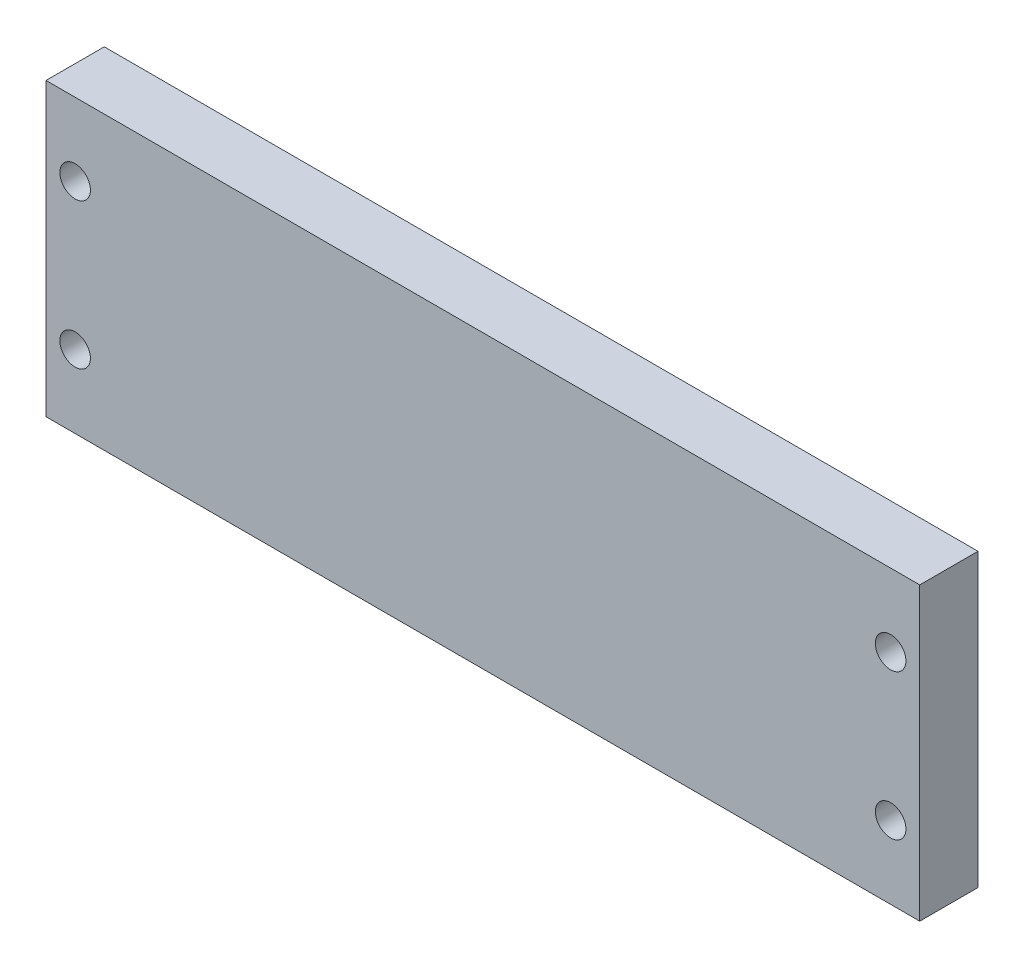
ISO-10303-21;
HEADER;
FILE_DESCRIPTION(('STEP AP214'),'2;1');
FILE_NAME('part.step','',(''),(''),'','','');
FILE_SCHEMA(('AUTOMOTIVE_DESIGN { 1 0 10303 214 1 1 1 1 }'));
ENDSEC;
DATA;
#1=APPLICATION_CONTEXT('core data for automotive mechanical design processes');
#2=APPLICATION_PROTOCOL_DEFINITION('international standard','automotive_design',2000,#1);
#3=PRODUCT_CONTEXT('',#1,'mechanical');
#4=PRODUCT('Part','Part','',(#3));
#5=PRODUCT_RELATED_PRODUCT_CATEGORY('part','',(#4));
#6=PRODUCT_DEFINITION_FORMATION('','',#4);
#7=PRODUCT_DEFINITION_CONTEXT('part definition',#1,'design');
#8=PRODUCT_DEFINITION('design','',#6,#7);
#9=PRODUCT_DEFINITION_SHAPE('','',#8);
#10=(LENGTH_UNIT() NAMED_UNIT(*) SI_UNIT(.MILLI.,.METRE.));
#11=(NAMED_UNIT(*) PLANE_ANGLE_UNIT() SI_UNIT($,.RADIAN.));
#12=(NAMED_UNIT(*) SI_UNIT($,.STERADIAN.) SOLID_ANGLE_UNIT());
#13=UNCERTAINTY_MEASURE_WITH_UNIT(LENGTH_MEASURE(1.E-05),#10,'distance_accuracy_value','');
#14=(GEOMETRIC_REPRESENTATION_CONTEXT(3) GLOBAL_UNCERTAINTY_ASSIGNED_CONTEXT((#13)) GLOBAL_UNIT_ASSIGNED_CONTEXT((#10,
#11,#12)) REPRESENTATION_CONTEXT('',''));
#15=CARTESIAN_POINT('',(0.,0.,0.));
#16=DIRECTION('',(0.,0.,1.));
#17=DIRECTION('',(1.,0.,0.));
#18=AXIS2_PLACEMENT_3D('',#15,#16,#17);
#19=CARTESIAN_POINT('',(-56.,-10.,-42.));
#20=DIRECTION('',(0.,0.,1.));
#21=DIRECTION('',(1.,0.,0.));
#22=AXIS2_PLACEMENT_3D('',#19,#20,#21);
#23=CYLINDRICAL_SURFACE('',#22,2.1);
#24=CARTESIAN_POINT('',(-56.,-10.,8.));
#25=DIRECTION('',(0.,0.,1.));
#26=DIRECTION('',(1.,0.,0.));
#27=AXIS2_PLACEMENT_3D('',#24,#25,#26);
#28=CIRCLE('',#27,2.1);
#29=CARTESIAN_POINT('',(-53.9,-10.,8.));
#30=VERTEX_POINT('',#29);
#31=EDGE_CURVE('E148',#30,#30,#28,.T.);
#32=ORIENTED_EDGE('',*,*,#31,.T.);
#33=EDGE_LOOP('',(#32));
#34=FACE_BOUND('',#33,.T.);
#35=CARTESIAN_POINT('',(-56.,-10.,5.));
#36=DIRECTION('',(0.,0.,-1.));
#37=DIRECTION('',(-1.,0.,0.));
#38=AXIS2_PLACEMENT_3D('',#35,#36,#37);
#39=CIRCLE('',#38,2.1);
#40=CARTESIAN_POINT('',(-58.1,-10.,5.));
#41=VERTEX_POINT('',#40);
#42=EDGE_CURVE('E37',#41,#41,#39,.F.);
#43=ORIENTED_EDGE('',*,*,#42,.F.);
#44=EDGE_LOOP('',(#43));
#45=FACE_BOUND('',#44,.T.);
#46=ADVANCED_FACE('F33',(#34,#45),#23,.F.);
#47=CARTESIAN_POINT('',(-56.,10.,-42.));
#48=DIRECTION('',(0.,0.,1.));
#49=DIRECTION('',(1.,0.,0.));
#50=AXIS2_PLACEMENT_3D('',#47,#48,#49);
#51=CYLINDRICAL_SURFACE('',#50,2.1);
#52=CARTESIAN_POINT('',(-56.,10.,8.));
#53=DIRECTION('',(0.,0.,1.));
#54=DIRECTION('',(1.,0.,0.));
#55=AXIS2_PLACEMENT_3D('',#52,#53,#54);
#56=CIRCLE('',#55,2.1);
#57=CARTESIAN_POINT('',(-53.9,10.,8.));
#58=VERTEX_POINT('',#57);
#59=EDGE_CURVE('E103',#58,#58,#56,.T.);
#60=ORIENTED_EDGE('',*,*,#59,.T.);
#61=EDGE_LOOP('',(#60));
#62=FACE_BOUND('',#61,.T.);
#63=CARTESIAN_POINT('',(-56.,10.,5.));
#64=DIRECTION('',(0.,0.,-1.));
#65=DIRECTION('',(-1.,0.,0.));
#66=AXIS2_PLACEMENT_3D('',#63,#64,#65);
#67=CIRCLE('',#66,2.1);
#68=CARTESIAN_POINT('',(-58.1,10.,5.));
#69=VERTEX_POINT('',#68);
#70=EDGE_CURVE('E118',#69,#69,#67,.F.);
#71=ORIENTED_EDGE('',*,*,#70,.F.);
#72=EDGE_LOOP('',(#71));
#73=FACE_BOUND('',#72,.T.);
#74=ADVANCED_FACE('F154',(#62,#73),#51,.F.);
#75=CARTESIAN_POINT('',(56.,-10.,-42.));
#76=DIRECTION('',(0.,0.,1.));
#77=DIRECTION('',(1.,0.,0.));
#78=AXIS2_PLACEMENT_3D('',#75,#76,#77);
#79=CYLINDRICAL_SURFACE('',#78,2.1);
#80=CARTESIAN_POINT('',(56.,-10.,8.));
#81=DIRECTION('',(0.,0.,1.));
#82=DIRECTION('',(1.,0.,0.));
#83=AXIS2_PLACEMENT_3D('',#80,#81,#82);
#84=CIRCLE('',#83,2.1);
#85=CARTESIAN_POINT('',(58.1,-10.,8.));
#86=VERTEX_POINT('',#85);
#87=EDGE_CURVE('E112',#86,#86,#84,.T.);
#88=ORIENTED_EDGE('',*,*,#87,.T.);
#89=EDGE_LOOP('',(#88));
#90=FACE_BOUND('',#89,.T.);
#91=CARTESIAN_POINT('',(56.,-10.,5.));
#92=DIRECTION('',(0.,0.,-1.));
#93=DIRECTION('',(-1.,0.,0.));
#94=AXIS2_PLACEMENT_3D('',#91,#92,#93);
#95=CIRCLE('',#94,2.1);
#96=CARTESIAN_POINT('',(53.9,-10.,5.));
#97=VERTEX_POINT('',#96);
#98=EDGE_CURVE('E114',#97,#97,#95,.F.);
#99=ORIENTED_EDGE('',*,*,#98,.F.);
#100=EDGE_LOOP('',(#99));
#101=FACE_BOUND('',#100,.T.);
#102=ADVANCED_FACE('F179',(#90,#101),#79,.F.);
#103=CARTESIAN_POINT('',(56.,10.,-42.));
#104=DIRECTION('',(0.,0.,1.));
#105=DIRECTION('',(1.,0.,0.));
#106=AXIS2_PLACEMENT_3D('',#103,#104,#105);
#107=CYLINDRICAL_SURFACE('',#106,2.1);
#108=CARTESIAN_POINT('',(56.,10.,8.));
#109=DIRECTION('',(0.,0.,1.));
#110=DIRECTION('',(1.,0.,0.));
#111=AXIS2_PLACEMENT_3D('',#108,#109,#110);
#112=CIRCLE('',#111,2.1);
#113=CARTESIAN_POINT('',(58.1,10.,8.));
#114=VERTEX_POINT('',#113);
#115=EDGE_CURVE('E145',#114,#114,#112,.T.);
#116=ORIENTED_EDGE('',*,*,#115,.T.);
#117=EDGE_LOOP('',(#116));
#118=FACE_BOUND('',#117,.T.);
#119=CARTESIAN_POINT('',(56.,10.,5.));
#120=DIRECTION('',(0.,0.,-1.));
#121=DIRECTION('',(-1.,0.,0.));
#122=AXIS2_PLACEMENT_3D('',#119,#120,#121);
#123=CIRCLE('',#122,2.1);
#124=CARTESIAN_POINT('',(53.9,10.,5.));
#125=VERTEX_POINT('',#124);
#126=EDGE_CURVE('E109',#125,#125,#123,.F.);
#127=ORIENTED_EDGE('',*,*,#126,.F.);
#128=EDGE_LOOP('',(#127));
#129=FACE_BOUND('',#128,.T.);
#130=ADVANCED_FACE('F182',(#118,#129),#107,.F.);
#131=CARTESIAN_POINT('',(60.,20.,8.));
#132=DIRECTION('',(-1.,0.,0.));
#133=DIRECTION('',(0.,-1.,0.));
#134=AXIS2_PLACEMENT_3D('',#131,#132,#133);
#135=PLANE('',#134);
#136=DIRECTION('',(0.,1.,0.));
#137=VECTOR('',#136,1.);
#138=CARTESIAN_POINT('',(60.,20.,0.));
#139=LINE('',#138,#137);
#140=CARTESIAN_POINT('',(60.,-20.,0.));
#141=VERTEX_POINT('',#140);
#142=CARTESIAN_POINT('',(60.,20.,0.));
#143=VERTEX_POINT('',#142);
#144=EDGE_CURVE('E100',#141,#143,#139,.T.);
#145=ORIENTED_EDGE('',*,*,#144,.T.);
#146=DIRECTION('',(0.,0.,-1.));
#147=VECTOR('',#146,1.);
#148=CARTESIAN_POINT('',(60.,20.,8.));
#149=LINE('',#148,#147);
#150=CARTESIAN_POINT('',(60.,20.,8.));
#151=VERTEX_POINT('',#150);
#152=EDGE_CURVE('E11',#151,#143,#149,.T.);
#153=ORIENTED_EDGE('',*,*,#152,.F.);
#154=DIRECTION('',(0.,1.,0.));
#155=VECTOR('',#154,1.);
#156=CARTESIAN_POINT('',(60.,20.,8.));
#157=LINE('',#156,#155);
#158=CARTESIAN_POINT('',(60.,-20.,8.));
#159=VERTEX_POINT('',#158);
#160=EDGE_CURVE('E87',#159,#151,#157,.T.);
#161=ORIENTED_EDGE('',*,*,#160,.F.);
#162=DIRECTION('',(0.,0.,-1.));
#163=VECTOR('',#162,1.);
#164=CARTESIAN_POINT('',(60.,-20.,8.));
#165=LINE('',#164,#163);
#166=EDGE_CURVE('E96',#159,#141,#165,.T.);
#167=ORIENTED_EDGE('',*,*,#166,.T.);
#168=EDGE_LOOP('',(#145,#153,#161,#167));
#169=FACE_BOUND('',#168,.T.);
#170=ADVANCED_FACE('F35',(#169),#135,.F.);
#171=CARTESIAN_POINT('',(-60.,20.,8.));
#172=DIRECTION('',(0.,-1.,0.));
#173=DIRECTION('',(0.,0.,-1.));
#174=AXIS2_PLACEMENT_3D('',#171,#172,#173);
#175=PLANE('',#174);
#176=DIRECTION('',(-1.,0.,0.));
#177=VECTOR('',#176,1.);
#178=CARTESIAN_POINT('',(-60.,20.,0.));
#179=LINE('',#178,#177);
#180=CARTESIAN_POINT('',(-60.,20.,0.));
#181=VERTEX_POINT('',#180);
#182=EDGE_CURVE('E91',#143,#181,#179,.T.);
#183=ORIENTED_EDGE('',*,*,#182,.T.);
#184=DIRECTION('',(0.,0.,-1.));
#185=VECTOR('',#184,1.);
#186=CARTESIAN_POINT('',(-60.,20.,8.));
#187=LINE('',#186,#185);
#188=CARTESIAN_POINT('',(-60.,20.,8.));
#189=VERTEX_POINT('',#188);
#190=EDGE_CURVE('E43',#189,#181,#187,.T.);
#191=ORIENTED_EDGE('',*,*,#190,.F.);
#192=DIRECTION('',(-1.,0.,0.));
#193=VECTOR('',#192,1.);
#194=CARTESIAN_POINT('',(-60.,20.,8.));
#195=LINE('',#194,#193);
#196=EDGE_CURVE('E82',#151,#189,#195,.T.);
#197=ORIENTED_EDGE('',*,*,#196,.F.);
#198=ORIENTED_EDGE('',*,*,#152,.T.);
#199=EDGE_LOOP('',(#183,#191,#197,#198));
#200=FACE_BOUND('',#199,.T.);
#201=ADVANCED_FACE('F90',(#200),#175,.F.);
#202=CARTESIAN_POINT('',(-60.,20.,8.));
#203=DIRECTION('',(1.,0.,0.));
#204=DIRECTION('',(0.,0.,-1.));
#205=AXIS2_PLACEMENT_3D('',#202,#203,#204);
#206=PLANE('',#205);
#207=DIRECTION('',(0.,-1.,0.));
#208=VECTOR('',#207,1.);
#209=CARTESIAN_POINT('',(-60.,20.,0.));
#210=LINE('',#209,#208);
#211=CARTESIAN_POINT('',(-60.,-20.,0.));
#212=VERTEX_POINT('',#211);
#213=EDGE_CURVE('E69',#181,#212,#210,.T.);
#214=ORIENTED_EDGE('',*,*,#213,.T.);
#215=DIRECTION('',(0.,0.,-1.));
#216=VECTOR('',#215,1.);
#217=CARTESIAN_POINT('',(-60.,-20.,8.));
#218=LINE('',#217,#216);
#219=CARTESIAN_POINT('',(-60.,-20.,8.));
#220=VERTEX_POINT('',#219);
#221=EDGE_CURVE('E92',#220,#212,#218,.T.);
#222=ORIENTED_EDGE('',*,*,#221,.F.);
#223=DIRECTION('',(0.,-1.,0.));
#224=VECTOR('',#223,1.);
#225=CARTESIAN_POINT('',(-60.,20.,8.));
#226=LINE('',#225,#224);
#227=EDGE_CURVE('E85',#189,#220,#226,.T.);
#228=ORIENTED_EDGE('',*,*,#227,.F.);
#229=ORIENTED_EDGE('',*,*,#190,.T.);
#230=EDGE_LOOP('',(#214,#222,#228,#229));
#231=FACE_BOUND('',#230,.T.);
#232=ADVANCED_FACE('F94',(#231),#206,.F.);
#233=CARTESIAN_POINT('',(-60.,-20.,8.));
#234=DIRECTION('',(0.,1.,0.));
#235=DIRECTION('',(0.,0.,1.));
#236=AXIS2_PLACEMENT_3D('',#233,#234,#235);
#237=PLANE('',#236);
#238=DIRECTION('',(1.,0.,0.));
#239=VECTOR('',#238,1.);
#240=CARTESIAN_POINT('',(-60.,-20.,0.));
#241=LINE('',#240,#239);
#242=EDGE_CURVE('E75',#212,#141,#241,.T.);
#243=ORIENTED_EDGE('',*,*,#242,.T.);
#244=ORIENTED_EDGE('',*,*,#166,.F.);
#245=DIRECTION('',(1.,0.,0.));
#246=VECTOR('',#245,1.);
#247=CARTESIAN_POINT('',(-60.,-20.,8.));
#248=LINE('',#247,#246);
#249=EDGE_CURVE('E52',#220,#159,#248,.T.);
#250=ORIENTED_EDGE('',*,*,#249,.F.);
#251=ORIENTED_EDGE('',*,*,#221,.T.);
#252=EDGE_LOOP('',(#243,#244,#250,#251));
#253=FACE_BOUND('',#252,.T.);
#254=ADVANCED_FACE('F159',(#253),#237,.F.);
#255=CARTESIAN_POINT('',(0.,0.,8.));
#256=DIRECTION('',(0.,0.,1.));
#257=DIRECTION('',(1.,0.,0.));
#258=AXIS2_PLACEMENT_3D('',#255,#256,#257);
#259=PLANE('',#258);
#260=ORIENTED_EDGE('',*,*,#87,.F.);
#261=EDGE_LOOP('',(#260));
#262=FACE_BOUND('',#261,.T.);
#263=ORIENTED_EDGE('',*,*,#115,.F.);
#264=EDGE_LOOP('',(#263));
#265=FACE_BOUND('',#264,.T.);
#266=ORIENTED_EDGE('',*,*,#31,.F.);
#267=EDGE_LOOP('',(#266));
#268=FACE_BOUND('',#267,.T.);
#269=ORIENTED_EDGE('',*,*,#59,.F.);
#270=EDGE_LOOP('',(#269));
#271=FACE_BOUND('',#270,.T.);
#272=ORIENTED_EDGE('',*,*,#160,.T.);
#273=ORIENTED_EDGE('',*,*,#196,.T.);
#274=ORIENTED_EDGE('',*,*,#227,.T.);
#275=ORIENTED_EDGE('',*,*,#249,.T.);
#276=EDGE_LOOP('',(#272,#273,#274,#275));
#277=FACE_BOUND('',#276,.T.);
#278=ADVANCED_FACE('F83',(#262,#265,#268,#271,#277),#259,.T.);
#279=CARTESIAN_POINT('',(0.,0.,0.));
#280=DIRECTION('',(0.,0.,1.));
#281=DIRECTION('',(1.,0.,0.));
#282=AXIS2_PLACEMENT_3D('',#279,#280,#281);
#283=PLANE('',#282);
#284=CARTESIAN_POINT('',(-56.,-10.,0.));
#285=DIRECTION('',(0.,0.,-1.));
#286=DIRECTION('',(-1.,0.,0.));
#287=AXIS2_PLACEMENT_3D('',#284,#285,#286);
#288=CIRCLE('',#287,3.55);
#289=CARTESIAN_POINT('',(-59.55,-10.,0.));
#290=VERTEX_POINT('',#289);
#291=EDGE_CURVE('E134',#290,#290,#288,.T.);
#292=ORIENTED_EDGE('',*,*,#291,.F.);
#293=EDGE_LOOP('',(#292));
#294=FACE_BOUND('',#293,.T.);
#295=CARTESIAN_POINT('',(-56.,10.,0.));
#296=DIRECTION('',(0.,0.,-1.));
#297=DIRECTION('',(-1.,0.,0.));
#298=AXIS2_PLACEMENT_3D('',#295,#296,#297);
#299=CIRCLE('',#298,3.55);
#300=CARTESIAN_POINT('',(-59.55,10.,0.));
#301=VERTEX_POINT('',#300);
#302=EDGE_CURVE('E127',#301,#301,#299,.T.);
#303=ORIENTED_EDGE('',*,*,#302,.F.);
#304=EDGE_LOOP('',(#303));
#305=FACE_BOUND('',#304,.T.);
#306=CARTESIAN_POINT('',(56.,-10.,0.));
#307=DIRECTION('',(0.,0.,-1.));
#308=DIRECTION('',(-1.,0.,0.));
#309=AXIS2_PLACEMENT_3D('',#306,#307,#308);
#310=CIRCLE('',#309,3.55);
#311=CARTESIAN_POINT('',(52.45,-10.,0.));
#312=VERTEX_POINT('',#311);
#313=EDGE_CURVE('E120',#312,#312,#310,.T.);
#314=ORIENTED_EDGE('',*,*,#313,.F.);
#315=EDGE_LOOP('',(#314));
#316=FACE_BOUND('',#315,.T.);
#317=CARTESIAN_POINT('',(56.,10.,0.));
#318=DIRECTION('',(0.,0.,-1.));
#319=DIRECTION('',(-1.,0.,0.));
#320=AXIS2_PLACEMENT_3D('',#317,#318,#319);
#321=CIRCLE('',#320,3.55);
#322=CARTESIAN_POINT('',(52.45,10.,0.));
#323=VERTEX_POINT('',#322);
#324=EDGE_CURVE('E116',#323,#323,#321,.T.);
#325=ORIENTED_EDGE('',*,*,#324,.F.);
#326=EDGE_LOOP('',(#325));
#327=FACE_BOUND('',#326,.T.);
#328=ORIENTED_EDGE('',*,*,#144,.F.);
#329=ORIENTED_EDGE('',*,*,#242,.F.);
#330=ORIENTED_EDGE('',*,*,#213,.F.);
#331=ORIENTED_EDGE('',*,*,#182,.F.);
#332=EDGE_LOOP('',(#328,#329,#330,#331));
#333=FACE_BOUND('',#332,.T.);
#334=ADVANCED_FACE('F158',(#294,#305,#316,#327,#333),#283,.F.);
#335=CARTESIAN_POINT('',(56.,10.,5.));
#336=DIRECTION('',(0.,0.,-1.));
#337=DIRECTION('',(-1.,0.,0.));
#338=AXIS2_PLACEMENT_3D('',#335,#336,#337);
#339=PLANE('',#338);
#340=CARTESIAN_POINT('',(56.,10.,5.));
#341=DIRECTION('',(0.,0.,-1.));
#342=DIRECTION('',(-1.,0.,0.));
#343=AXIS2_PLACEMENT_3D('',#340,#341,#342);
#344=CIRCLE('',#343,3.55);
#345=CARTESIAN_POINT('',(52.45,10.,5.));
#346=VERTEX_POINT('',#345);
#347=EDGE_CURVE('E113',#346,#346,#344,.T.);
#348=ORIENTED_EDGE('',*,*,#347,.T.);
#349=EDGE_LOOP('',(#348));
#350=FACE_BOUND('',#349,.T.);
#351=ORIENTED_EDGE('',*,*,#126,.T.);
#352=EDGE_LOOP('',(#351));
#353=FACE_BOUND('',#352,.T.);
#354=ADVANCED_FACE('F166',(#350,#353),#339,.T.);
#355=CARTESIAN_POINT('',(56.,10.,5.));
#356=DIRECTION('',(0.,0.,-1.));
#357=DIRECTION('',(-1.,0.,0.));
#358=AXIS2_PLACEMENT_3D('',#355,#356,#357);
#359=CYLINDRICAL_SURFACE('',#358,3.55);
#360=ORIENTED_EDGE('',*,*,#347,.F.);
#361=EDGE_LOOP('',(#360));
#362=FACE_BOUND('',#361,.T.);
#363=ORIENTED_EDGE('',*,*,#324,.T.);
#364=EDGE_LOOP('',(#363));
#365=FACE_BOUND('',#364,.T.);
#366=ADVANCED_FACE('F189',(#362,#365),#359,.F.);
#367=CARTESIAN_POINT('',(56.,-10.,5.));
#368=DIRECTION('',(0.,0.,-1.));
#369=DIRECTION('',(-1.,0.,0.));
#370=AXIS2_PLACEMENT_3D('',#367,#368,#369);
#371=PLANE('',#370);
#372=CARTESIAN_POINT('',(56.,-10.,5.));
#373=DIRECTION('',(0.,0.,-1.));
#374=DIRECTION('',(-1.,0.,0.));
#375=AXIS2_PLACEMENT_3D('',#372,#373,#374);
#376=CIRCLE('',#375,3.55);
#377=CARTESIAN_POINT('',(52.45,-10.,5.));
#378=VERTEX_POINT('',#377);
#379=EDGE_CURVE('E117',#378,#378,#376,.T.);
#380=ORIENTED_EDGE('',*,*,#379,.T.);
#381=EDGE_LOOP('',(#380));
#382=FACE_BOUND('',#381,.T.);
#383=ORIENTED_EDGE('',*,*,#98,.T.);
#384=EDGE_LOOP('',(#383));
#385=FACE_BOUND('',#384,.T.);
#386=ADVANCED_FACE('F192',(#382,#385),#371,.T.);
#387=CARTESIAN_POINT('',(56.,-10.,5.));
#388=DIRECTION('',(0.,0.,-1.));
#389=DIRECTION('',(-1.,0.,0.));
#390=AXIS2_PLACEMENT_3D('',#387,#388,#389);
#391=CYLINDRICAL_SURFACE('',#390,3.55);
#392=ORIENTED_EDGE('',*,*,#379,.F.);
#393=EDGE_LOOP('',(#392));
#394=FACE_BOUND('',#393,.T.);
#395=ORIENTED_EDGE('',*,*,#313,.T.);
#396=EDGE_LOOP('',(#395));
#397=FACE_BOUND('',#396,.T.);
#398=ADVANCED_FACE('F197',(#394,#397),#391,.F.);
#399=CARTESIAN_POINT('',(-56.,10.,5.));
#400=DIRECTION('',(0.,0.,-1.));
#401=DIRECTION('',(-1.,0.,0.));
#402=AXIS2_PLACEMENT_3D('',#399,#400,#401);
#403=PLANE('',#402);
#404=CARTESIAN_POINT('',(-56.,10.,5.));
#405=DIRECTION('',(0.,0.,-1.));
#406=DIRECTION('',(-1.,0.,0.));
#407=AXIS2_PLACEMENT_3D('',#404,#405,#406);
#408=CIRCLE('',#407,3.55);
#409=CARTESIAN_POINT('',(-59.55,10.,5.));
#410=VERTEX_POINT('',#409);
#411=EDGE_CURVE('E121',#410,#410,#408,.T.);
#412=ORIENTED_EDGE('',*,*,#411,.T.);
#413=EDGE_LOOP('',(#412));
#414=FACE_BOUND('',#413,.T.);
#415=ORIENTED_EDGE('',*,*,#70,.T.);
#416=EDGE_LOOP('',(#415));
#417=FACE_BOUND('',#416,.T.);
#418=ADVANCED_FACE('F200',(#414,#417),#403,.T.);
#419=CARTESIAN_POINT('',(-56.,10.,5.));
#420=DIRECTION('',(0.,0.,-1.));
#421=DIRECTION('',(-1.,0.,0.));
#422=AXIS2_PLACEMENT_3D('',#419,#420,#421);
#423=CYLINDRICAL_SURFACE('',#422,3.55);
#424=ORIENTED_EDGE('',*,*,#411,.F.);
#425=EDGE_LOOP('',(#424));
#426=FACE_BOUND('',#425,.T.);
#427=ORIENTED_EDGE('',*,*,#302,.T.);
#428=EDGE_LOOP('',(#427));
#429=FACE_BOUND('',#428,.T.);
#430=ADVANCED_FACE('F205',(#426,#429),#423,.F.);
#431=CARTESIAN_POINT('',(-56.,-10.,5.));
#432=DIRECTION('',(0.,0.,-1.));
#433=DIRECTION('',(-1.,0.,0.));
#434=AXIS2_PLACEMENT_3D('',#431,#432,#433);
#435=PLANE('',#434);
#436=CARTESIAN_POINT('',(-56.,-10.,5.));
#437=DIRECTION('',(0.,0.,-1.));
#438=DIRECTION('',(-1.,0.,0.));
#439=AXIS2_PLACEMENT_3D('',#436,#437,#438);
#440=CIRCLE('',#439,3.55);
#441=CARTESIAN_POINT('',(-59.55,-10.,5.));
#442=VERTEX_POINT('',#441);
#443=EDGE_CURVE('E223',#442,#442,#440,.T.);
#444=ORIENTED_EDGE('',*,*,#443,.T.);
#445=EDGE_LOOP('',(#444));
#446=FACE_BOUND('',#445,.T.);
#447=ORIENTED_EDGE('',*,*,#42,.T.);
#448=EDGE_LOOP('',(#447));
#449=FACE_BOUND('',#448,.T.);
#450=ADVANCED_FACE('F208',(#446,#449),#435,.T.);
#451=CARTESIAN_POINT('',(-56.,-10.,5.));
#452=DIRECTION('',(0.,0.,-1.));
#453=DIRECTION('',(-1.,0.,0.));
#454=AXIS2_PLACEMENT_3D('',#451,#452,#453);
#455=CYLINDRICAL_SURFACE('',#454,3.55);
#456=ORIENTED_EDGE('',*,*,#443,.F.);
#457=EDGE_LOOP('',(#456));
#458=FACE_BOUND('',#457,.T.);
#459=ORIENTED_EDGE('',*,*,#291,.T.);
#460=EDGE_LOOP('',(#459));
#461=FACE_BOUND('',#460,.T.);
#462=ADVANCED_FACE('F212',(#458,#461),#455,.F.);
#463=CLOSED_SHELL('',(#46,#74,#102,#130,#170,#201,#232,#254,#278,#334,#354,#366,#386,#398,#418,
#430,#450,#462));
#464=MANIFOLD_SOLID_BREP('B2',#463);
#465=ADVANCED_BREP_SHAPE_REPRESENTATION('',(#18,#464),#14);
#466=SHAPE_DEFINITION_REPRESENTATION(#9,#465);
ENDSEC;
END-ISO-10303-21;
